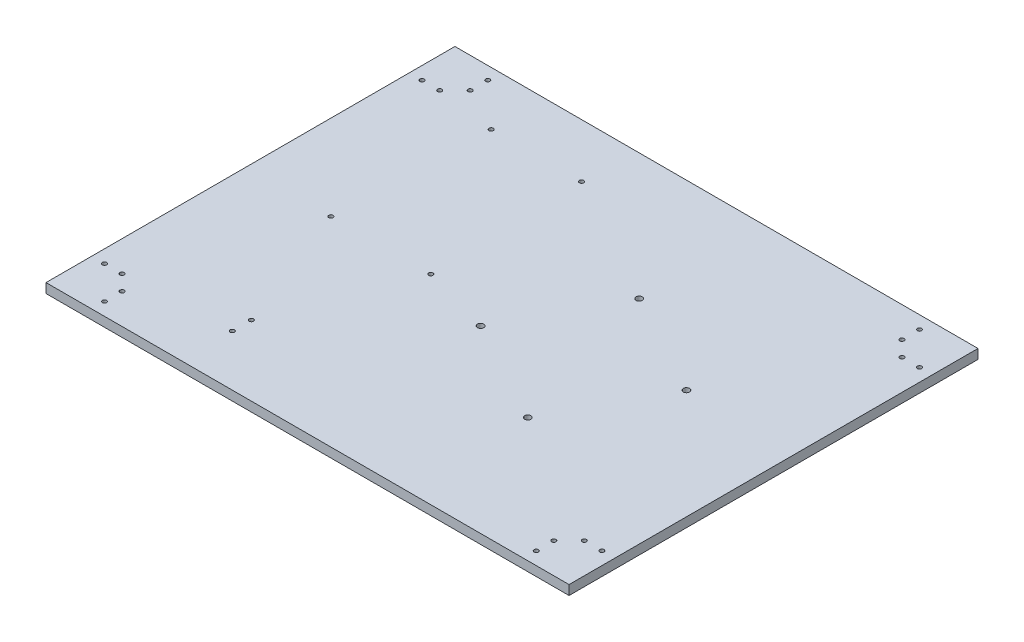
ISO-10303-21;
HEADER;
FILE_DESCRIPTION(('STEP AP214'),'2;1');
FILE_NAME('part.step','',(''),(''),'','','');
FILE_SCHEMA(('AUTOMOTIVE_DESIGN { 1 0 10303 214 1 1 1 1 }'));
ENDSEC;
DATA;
#1=APPLICATION_CONTEXT('core data for automotive mechanical design processes');
#2=APPLICATION_PROTOCOL_DEFINITION('international standard','automotive_design',2000,#1);
#3=PRODUCT_CONTEXT('',#1,'mechanical');
#4=PRODUCT('Part','Part','',(#3));
#5=PRODUCT_RELATED_PRODUCT_CATEGORY('part','',(#4));
#6=PRODUCT_DEFINITION_FORMATION('','',#4);
#7=PRODUCT_DEFINITION_CONTEXT('part definition',#1,'design');
#8=PRODUCT_DEFINITION('design','',#6,#7);
#9=PRODUCT_DEFINITION_SHAPE('','',#8);
#10=(LENGTH_UNIT() NAMED_UNIT(*) SI_UNIT(.MILLI.,.METRE.));
#11=(NAMED_UNIT(*) PLANE_ANGLE_UNIT() SI_UNIT($,.RADIAN.));
#12=(NAMED_UNIT(*) SI_UNIT($,.STERADIAN.) SOLID_ANGLE_UNIT());
#13=UNCERTAINTY_MEASURE_WITH_UNIT(LENGTH_MEASURE(1.E-05),#10,'distance_accuracy_value','');
#14=(GEOMETRIC_REPRESENTATION_CONTEXT(3) GLOBAL_UNCERTAINTY_ASSIGNED_CONTEXT((#13)) GLOBAL_UNIT_ASSIGNED_CONTEXT((#10,
#11,#12)) REPRESENTATION_CONTEXT('',''));
#15=CARTESIAN_POINT('',(0.,0.,0.));
#16=DIRECTION('',(0.,0.,1.));
#17=DIRECTION('',(1.,0.,0.));
#18=AXIS2_PLACEMENT_3D('',#15,#16,#17);
#19=CARTESIAN_POINT('',(-275.,10.,-215.));
#20=DIRECTION('',(1.,0.,0.));
#21=DIRECTION('',(0.,0.,-1.));
#22=AXIS2_PLACEMENT_3D('',#19,#20,#21);
#23=PLANE('',#22);
#24=DIRECTION('',(0.,0.,1.));
#25=VECTOR('',#24,1.);
#26=CARTESIAN_POINT('',(-275.,0.,-215.));
#27=LINE('',#26,#25);
#28=CARTESIAN_POINT('',(-275.,0.,-215.));
#29=VERTEX_POINT('',#28);
#30=CARTESIAN_POINT('',(-275.,0.,215.));
#31=VERTEX_POINT('',#30);
#32=EDGE_CURVE('E103',#29,#31,#27,.T.);
#33=ORIENTED_EDGE('',*,*,#32,.T.);
#34=DIRECTION('',(0.,-1.,0.));
#35=VECTOR('',#34,1.);
#36=CARTESIAN_POINT('',(-275.,10.,215.));
#37=LINE('',#36,#35);
#38=CARTESIAN_POINT('',(-275.,10.,215.));
#39=VERTEX_POINT('',#38);
#40=EDGE_CURVE('E11',#39,#31,#37,.T.);
#41=ORIENTED_EDGE('',*,*,#40,.F.);
#42=DIRECTION('',(0.,0.,1.));
#43=VECTOR('',#42,1.);
#44=CARTESIAN_POINT('',(-275.,10.,-215.));
#45=LINE('',#44,#43);
#46=CARTESIAN_POINT('',(-275.,10.,-215.));
#47=VERTEX_POINT('',#46);
#48=EDGE_CURVE('E90',#47,#39,#45,.T.);
#49=ORIENTED_EDGE('',*,*,#48,.F.);
#50=DIRECTION('',(0.,-1.,0.));
#51=VECTOR('',#50,1.);
#52=CARTESIAN_POINT('',(-275.,10.,-215.));
#53=LINE('',#52,#51);
#54=EDGE_CURVE('E99',#47,#29,#53,.T.);
#55=ORIENTED_EDGE('',*,*,#54,.T.);
#56=EDGE_LOOP('',(#33,#41,#49,#55));
#57=FACE_BOUND('',#56,.T.);
#58=ADVANCED_FACE('F37',(#57),#23,.F.);
#59=CARTESIAN_POINT('',(-275.,10.,215.));
#60=DIRECTION('',(0.,0.,-1.));
#61=DIRECTION('',(-1.,0.,0.));
#62=AXIS2_PLACEMENT_3D('',#59,#60,#61);
#63=PLANE('',#62);
#64=DIRECTION('',(1.,0.,0.));
#65=VECTOR('',#64,1.);
#66=CARTESIAN_POINT('',(-275.,0.,215.));
#67=LINE('',#66,#65);
#68=CARTESIAN_POINT('',(275.,0.,215.));
#69=VERTEX_POINT('',#68);
#70=EDGE_CURVE('E94',#31,#69,#67,.T.);
#71=ORIENTED_EDGE('',*,*,#70,.T.);
#72=DIRECTION('',(0.,-1.,0.));
#73=VECTOR('',#72,1.);
#74=CARTESIAN_POINT('',(275.,10.,215.));
#75=LINE('',#74,#73);
#76=CARTESIAN_POINT('',(275.,10.,215.));
#77=VERTEX_POINT('',#76);
#78=EDGE_CURVE('E46',#77,#69,#75,.T.);
#79=ORIENTED_EDGE('',*,*,#78,.F.);
#80=DIRECTION('',(1.,0.,0.));
#81=VECTOR('',#80,1.);
#82=CARTESIAN_POINT('',(-275.,10.,215.));
#83=LINE('',#82,#81);
#84=EDGE_CURVE('E85',#39,#77,#83,.T.);
#85=ORIENTED_EDGE('',*,*,#84,.F.);
#86=ORIENTED_EDGE('',*,*,#40,.T.);
#87=EDGE_LOOP('',(#71,#79,#85,#86));
#88=FACE_BOUND('',#87,.T.);
#89=ADVANCED_FACE('F93',(#88),#63,.F.);
#90=CARTESIAN_POINT('',(275.,10.,-215.));
#91=DIRECTION('',(-1.,0.,0.));
#92=DIRECTION('',(0.,0.,1.));
#93=AXIS2_PLACEMENT_3D('',#90,#91,#92);
#94=PLANE('',#93);
#95=DIRECTION('',(0.,0.,-1.));
#96=VECTOR('',#95,1.);
#97=CARTESIAN_POINT('',(275.,0.,-215.));
#98=LINE('',#97,#96);
#99=CARTESIAN_POINT('',(275.,0.,-215.));
#100=VERTEX_POINT('',#99);
#101=EDGE_CURVE('E72',#69,#100,#98,.T.);
#102=ORIENTED_EDGE('',*,*,#101,.T.);
#103=DIRECTION('',(0.,-1.,0.));
#104=VECTOR('',#103,1.);
#105=CARTESIAN_POINT('',(275.,10.,-215.));
#106=LINE('',#105,#104);
#107=CARTESIAN_POINT('',(275.,10.,-215.));
#108=VERTEX_POINT('',#107);
#109=EDGE_CURVE('E95',#108,#100,#106,.T.);
#110=ORIENTED_EDGE('',*,*,#109,.F.);
#111=DIRECTION('',(0.,0.,-1.));
#112=VECTOR('',#111,1.);
#113=CARTESIAN_POINT('',(275.,10.,-215.));
#114=LINE('',#113,#112);
#115=EDGE_CURVE('E88',#77,#108,#114,.T.);
#116=ORIENTED_EDGE('',*,*,#115,.F.);
#117=ORIENTED_EDGE('',*,*,#78,.T.);
#118=EDGE_LOOP('',(#102,#110,#116,#117));
#119=FACE_BOUND('',#118,.T.);
#120=ADVANCED_FACE('F97',(#119),#94,.F.);
#121=CARTESIAN_POINT('',(-275.,10.,-215.));
#122=DIRECTION('',(0.,0.,1.));
#123=DIRECTION('',(1.,0.,0.));
#124=AXIS2_PLACEMENT_3D('',#121,#122,#123);
#125=PLANE('',#124);
#126=DIRECTION('',(-1.,0.,0.));
#127=VECTOR('',#126,1.);
#128=CARTESIAN_POINT('',(-275.,0.,-215.));
#129=LINE('',#128,#127);
#130=EDGE_CURVE('E78',#100,#29,#129,.T.);
#131=ORIENTED_EDGE('',*,*,#130,.T.);
#132=ORIENTED_EDGE('',*,*,#54,.F.);
#133=DIRECTION('',(-1.,0.,0.));
#134=VECTOR('',#133,1.);
#135=CARTESIAN_POINT('',(-275.,10.,-215.));
#136=LINE('',#135,#134);
#137=EDGE_CURVE('E55',#108,#47,#136,.T.);
#138=ORIENTED_EDGE('',*,*,#137,.F.);
#139=ORIENTED_EDGE('',*,*,#109,.T.);
#140=EDGE_LOOP('',(#131,#132,#138,#139));
#141=FACE_BOUND('',#140,.T.);
#142=ADVANCED_FACE('F198',(#141),#125,.F.);
#143=CARTESIAN_POINT('',(0.,10.,0.));
#144=DIRECTION('',(0.,1.,0.));
#145=DIRECTION('',(0.,0.,1.));
#146=AXIS2_PLACEMENT_3D('',#143,#144,#145);
#147=PLANE('',#146);
#148=CARTESIAN_POINT('',(-185.379678999999,10.,4.99999999999939));
#149=DIRECTION('',(0.,1.,0.));
#150=DIRECTION('',(0.,0.,1.));
#151=AXIS2_PLACEMENT_3D('',#148,#149,#150);
#152=CIRCLE('',#151,2.25000000000001);
#153=CARTESIAN_POINT('',(-185.379678999999,10.,7.2499999999994));
#154=VERTEX_POINT('',#153);
#155=EDGE_CURVE('E671',#154,#154,#152,.T.);
#156=ORIENTED_EDGE('',*,*,#155,.F.);
#157=EDGE_LOOP('',(#156));
#158=FACE_BOUND('',#157,.T.);
#159=CARTESIAN_POINT('',(-80.3796789999997,10.,4.99999999999939));
#160=DIRECTION('',(0.,1.,0.));
#161=DIRECTION('',(0.,0.,1.));
#162=AXIS2_PLACEMENT_3D('',#159,#160,#161);
#163=CIRCLE('',#162,2.25);
#164=CARTESIAN_POINT('',(-80.3796789999997,10.,7.24999999999939));
#165=VERTEX_POINT('',#164);
#166=EDGE_CURVE('E677',#165,#165,#163,.T.);
#167=ORIENTED_EDGE('',*,*,#166,.F.);
#168=EDGE_LOOP('',(#167));
#169=FACE_BOUND('',#168,.T.);
#170=CARTESIAN_POINT('',(-85.3796789999992,10.,-158.500000000001));
#171=DIRECTION('',(0.,1.,0.));
#172=DIRECTION('',(0.,0.,1.));
#173=AXIS2_PLACEMENT_3D('',#170,#171,#172);
#174=CIRCLE('',#173,2.25);
#175=CARTESIAN_POINT('',(-85.3796789999992,10.,-156.250000000001));
#176=VERTEX_POINT('',#175);
#177=EDGE_CURVE('E666',#176,#176,#174,.T.);
#178=ORIENTED_EDGE('',*,*,#177,.F.);
#179=EDGE_LOOP('',(#178));
#180=FACE_BOUND('',#179,.T.);
#181=CARTESIAN_POINT('',(-180.379678999999,10.,-158.500000000001));
#182=DIRECTION('',(0.,1.,0.));
#183=DIRECTION('',(0.,0.,1.));
#184=AXIS2_PLACEMENT_3D('',#181,#182,#183);
#185=CIRCLE('',#184,2.25000000000001);
#186=CARTESIAN_POINT('',(-180.379678999999,10.,-156.250000000001));
#187=VERTEX_POINT('',#186);
#188=EDGE_CURVE('E663',#187,#187,#185,.T.);
#189=ORIENTED_EDGE('',*,*,#188,.F.);
#190=EDGE_LOOP('',(#189));
#191=FACE_BOUND('',#190,.T.);
#192=CARTESIAN_POINT('',(-132.921607377058,10.,161.135242980903));
#193=DIRECTION('',(0.,-1.,0.));
#194=DIRECTION('',(0.,0.,-1.));
#195=AXIS2_PLACEMENT_3D('',#192,#193,#194);
#196=CIRCLE('',#195,2.25000000000001);
#197=CARTESIAN_POINT('',(-132.921607377058,10.,158.885242980903));
#198=VERTEX_POINT('',#197);
#199=EDGE_CURVE('E630',#198,#198,#196,.T.);
#200=ORIENTED_EDGE('',*,*,#199,.T.);
#201=EDGE_LOOP('',(#200));
#202=FACE_BOUND('',#201,.T.);
#203=CARTESIAN_POINT('',(-132.921607377058,10.,141.135242980903));
#204=DIRECTION('',(0.,-1.,0.));
#205=DIRECTION('',(0.,0.,-1.));
#206=AXIS2_PLACEMENT_3D('',#203,#204,#205);
#207=CIRCLE('',#206,2.25000000000001);
#208=CARTESIAN_POINT('',(-132.921607377058,10.,138.885242980903));
#209=VERTEX_POINT('',#208);
#210=EDGE_CURVE('E651',#209,#209,#207,.T.);
#211=ORIENTED_EDGE('',*,*,#210,.T.);
#212=EDGE_LOOP('',(#211));
#213=FACE_BOUND('',#212,.T.);
#214=CARTESIAN_POINT('',(101.151165147925,10.,84.5267423870598));
#215=DIRECTION('',(0.,1.,0.));
#216=DIRECTION('',(0.,0.,1.));
#217=AXIS2_PLACEMENT_3D('',#214,#215,#216);
#218=CIRCLE('',#217,3.29999999999999);
#219=CARTESIAN_POINT('',(101.151165147925,10.,87.8267423870598));
#220=VERTEX_POINT('',#219);
#221=EDGE_CURVE('E645',#220,#220,#218,.T.);
#222=ORIENTED_EDGE('',*,*,#221,.F.);
#223=EDGE_LOOP('',(#222));
#224=FACE_BOUND('',#223,.T.);
#225=CARTESIAN_POINT('',(51.5287108520749,10.,-82.2473923870599));
#226=DIRECTION('',(0.,1.,0.));
#227=DIRECTION('',(0.,0.,1.));
#228=AXIS2_PLACEMENT_3D('',#225,#226,#227);
#229=CIRCLE('',#228,3.3);
#230=CARTESIAN_POINT('',(51.5287108520749,10.,-78.9473923870599));
#231=VERTEX_POINT('',#230);
#232=EDGE_CURVE('E642',#231,#231,#229,.T.);
#233=ORIENTED_EDGE('',*,*,#232,.F.);
#234=EDGE_LOOP('',(#233));
#235=FACE_BOUND('',#234,.T.);
#236=CARTESIAN_POINT('',(159.72700538706,10.,-23.6715521479252));
#237=DIRECTION('',(0.,1.,0.));
#238=DIRECTION('',(0.,0.,1.));
#239=AXIS2_PLACEMENT_3D('',#236,#237,#238);
#240=CIRCLE('',#239,3.3);
#241=CARTESIAN_POINT('',(159.72700538706,10.,-20.3715521479252));
#242=VERTEX_POINT('',#241);
#243=EDGE_CURVE('E636',#242,#242,#240,.T.);
#244=ORIENTED_EDGE('',*,*,#243,.F.);
#245=EDGE_LOOP('',(#244));
#246=FACE_BOUND('',#245,.T.);
#247=CARTESIAN_POINT('',(-7.04712938705974,10.,25.9509021479251));
#248=DIRECTION('',(0.,1.,0.));
#249=DIRECTION('',(0.,0.,1.));
#250=AXIS2_PLACEMENT_3D('',#247,#248,#249);
#251=CIRCLE('',#250,3.30000000000001);
#252=CARTESIAN_POINT('',(-7.04712938705974,10.,29.2509021479252));
#253=VERTEX_POINT('',#252);
#254=EDGE_CURVE('E629',#253,#253,#251,.T.);
#255=ORIENTED_EDGE('',*,*,#254,.F.);
#256=EDGE_LOOP('',(#255));
#257=FACE_BOUND('',#256,.T.);
#258=CARTESIAN_POINT('',(261.5,10.,167.));
#259=DIRECTION('',(0.,1.,0.));
#260=DIRECTION('',(0.,0.,1.));
#261=AXIS2_PLACEMENT_3D('',#258,#259,#260);
#262=CIRCLE('',#261,2.24999999999996);
#263=CARTESIAN_POINT('',(261.5,10.,169.25));
#264=VERTEX_POINT('',#263);
#265=EDGE_CURVE('E551',#264,#264,#262,.T.);
#266=ORIENTED_EDGE('',*,*,#265,.F.);
#267=EDGE_LOOP('',(#266));
#268=FACE_BOUND('',#267,.T.);
#269=CARTESIAN_POINT('',(261.5,10.,-167.));
#270=DIRECTION('',(0.,1.,0.));
#271=DIRECTION('',(0.,0.,1.));
#272=AXIS2_PLACEMENT_3D('',#269,#270,#271);
#273=CIRCLE('',#272,2.24999999999996);
#274=CARTESIAN_POINT('',(261.5,10.,-164.75));
#275=VERTEX_POINT('',#274);
#276=EDGE_CURVE('E554',#275,#275,#273,.T.);
#277=ORIENTED_EDGE('',*,*,#276,.F.);
#278=EDGE_LOOP('',(#277));
#279=FACE_BOUND('',#278,.T.);
#280=CARTESIAN_POINT('',(243.,10.,-167.));
#281=DIRECTION('',(0.,1.,0.));
#282=DIRECTION('',(0.,0.,1.));
#283=AXIS2_PLACEMENT_3D('',#280,#281,#282);
#284=CIRCLE('',#283,2.25000000000001);
#285=CARTESIAN_POINT('',(243.,10.,-164.75));
#286=VERTEX_POINT('',#285);
#287=EDGE_CURVE('E573',#286,#286,#284,.T.);
#288=ORIENTED_EDGE('',*,*,#287,.F.);
#289=EDGE_LOOP('',(#288));
#290=FACE_BOUND('',#289,.T.);
#291=CARTESIAN_POINT('',(227.,10.,-183.));
#292=DIRECTION('',(0.,1.,0.));
#293=DIRECTION('',(0.,0.,1.));
#294=AXIS2_PLACEMENT_3D('',#291,#292,#293);
#295=CIRCLE('',#294,2.25000000000001);
#296=CARTESIAN_POINT('',(227.,10.,-180.75));
#297=VERTEX_POINT('',#296);
#298=EDGE_CURVE('E569',#297,#297,#295,.T.);
#299=ORIENTED_EDGE('',*,*,#298,.F.);
#300=EDGE_LOOP('',(#299));
#301=FACE_BOUND('',#300,.T.);
#302=CARTESIAN_POINT('',(-227.,10.,-183.));
#303=DIRECTION('',(0.,1.,0.));
#304=DIRECTION('',(0.,0.,1.));
#305=AXIS2_PLACEMENT_3D('',#302,#303,#304);
#306=CIRCLE('',#305,2.25000000000001);
#307=CARTESIAN_POINT('',(-227.,10.,-180.75));
#308=VERTEX_POINT('',#307);
#309=EDGE_CURVE('E584',#308,#308,#306,.T.);
#310=ORIENTED_EDGE('',*,*,#309,.F.);
#311=EDGE_LOOP('',(#310));
#312=FACE_BOUND('',#311,.T.);
#313=CARTESIAN_POINT('',(-243.,10.,-167.));
#314=DIRECTION('',(0.,1.,0.));
#315=DIRECTION('',(0.,0.,1.));
#316=AXIS2_PLACEMENT_3D('',#313,#314,#315);
#317=CIRCLE('',#316,2.25000000000001);
#318=CARTESIAN_POINT('',(-243.,10.,-164.75));
#319=VERTEX_POINT('',#318);
#320=EDGE_CURVE('E581',#319,#319,#317,.T.);
#321=ORIENTED_EDGE('',*,*,#320,.F.);
#322=EDGE_LOOP('',(#321));
#323=FACE_BOUND('',#322,.T.);
#324=CARTESIAN_POINT('',(-261.5,10.,-167.));
#325=DIRECTION('',(0.,1.,0.));
#326=DIRECTION('',(0.,0.,1.));
#327=AXIS2_PLACEMENT_3D('',#324,#325,#326);
#328=CIRCLE('',#327,2.24999999999996);
#329=CARTESIAN_POINT('',(-261.5,10.,-164.75));
#330=VERTEX_POINT('',#329);
#331=EDGE_CURVE('E578',#330,#330,#328,.T.);
#332=ORIENTED_EDGE('',*,*,#331,.F.);
#333=EDGE_LOOP('',(#332));
#334=FACE_BOUND('',#333,.T.);
#335=CARTESIAN_POINT('',(227.,10.,-201.5));
#336=DIRECTION('',(0.,1.,0.));
#337=DIRECTION('',(0.,0.,1.));
#338=AXIS2_PLACEMENT_3D('',#335,#336,#337);
#339=CIRCLE('',#338,2.25000000000001);
#340=CARTESIAN_POINT('',(227.,10.,-199.25));
#341=VERTEX_POINT('',#340);
#342=EDGE_CURVE('E572',#341,#341,#339,.T.);
#343=ORIENTED_EDGE('',*,*,#342,.F.);
#344=EDGE_LOOP('',(#343));
#345=FACE_BOUND('',#344,.T.);
#346=CARTESIAN_POINT('',(-261.5,10.,167.));
#347=DIRECTION('',(0.,1.,0.));
#348=DIRECTION('',(0.,0.,1.));
#349=AXIS2_PLACEMENT_3D('',#346,#347,#348);
#350=CIRCLE('',#349,2.24999999999996);
#351=CARTESIAN_POINT('',(-261.5,10.,169.25));
#352=VERTEX_POINT('',#351);
#353=EDGE_CURVE('E560',#352,#352,#350,.T.);
#354=ORIENTED_EDGE('',*,*,#353,.F.);
#355=EDGE_LOOP('',(#354));
#356=FACE_BOUND('',#355,.T.);
#357=CARTESIAN_POINT('',(-243.,10.,167.));
#358=DIRECTION('',(0.,1.,0.));
#359=DIRECTION('',(0.,0.,1.));
#360=AXIS2_PLACEMENT_3D('',#357,#358,#359);
#361=CIRCLE('',#360,2.25000000000001);
#362=CARTESIAN_POINT('',(-243.,10.,169.25));
#363=VERTEX_POINT('',#362);
#364=EDGE_CURVE('E606',#363,#363,#361,.T.);
#365=ORIENTED_EDGE('',*,*,#364,.F.);
#366=EDGE_LOOP('',(#365));
#367=FACE_BOUND('',#366,.T.);
#368=CARTESIAN_POINT('',(-227.,10.,183.));
#369=DIRECTION('',(0.,1.,0.));
#370=DIRECTION('',(0.,0.,1.));
#371=AXIS2_PLACEMENT_3D('',#368,#369,#370);
#372=CIRCLE('',#371,2.25000000000001);
#373=CARTESIAN_POINT('',(-227.,10.,185.25));
#374=VERTEX_POINT('',#373);
#375=EDGE_CURVE('E568',#374,#374,#372,.T.);
#376=ORIENTED_EDGE('',*,*,#375,.F.);
#377=EDGE_LOOP('',(#376));
#378=FACE_BOUND('',#377,.T.);
#379=CARTESIAN_POINT('',(-227.,10.,201.5));
#380=DIRECTION('',(0.,1.,0.));
#381=DIRECTION('',(0.,0.,1.));
#382=AXIS2_PLACEMENT_3D('',#379,#380,#381);
#383=CIRCLE('',#382,2.25000000000001);
#384=CARTESIAN_POINT('',(-227.,10.,203.75));
#385=VERTEX_POINT('',#384);
#386=EDGE_CURVE('E565',#385,#385,#383,.T.);
#387=ORIENTED_EDGE('',*,*,#386,.F.);
#388=EDGE_LOOP('',(#387));
#389=FACE_BOUND('',#388,.T.);
#390=CARTESIAN_POINT('',(227.,10.,201.5));
#391=DIRECTION('',(0.,1.,0.));
#392=DIRECTION('',(0.,0.,1.));
#393=AXIS2_PLACEMENT_3D('',#390,#391,#392);
#394=CIRCLE('',#393,2.25000000000001);
#395=CARTESIAN_POINT('',(227.,10.,203.75));
#396=VERTEX_POINT('',#395);
#397=EDGE_CURVE('E557',#396,#396,#394,.T.);
#398=ORIENTED_EDGE('',*,*,#397,.F.);
#399=EDGE_LOOP('',(#398));
#400=FACE_BOUND('',#399,.T.);
#401=CARTESIAN_POINT('',(227.,10.,183.));
#402=DIRECTION('',(0.,1.,0.));
#403=DIRECTION('',(0.,0.,1.));
#404=AXIS2_PLACEMENT_3D('',#401,#402,#403);
#405=CIRCLE('',#404,2.25000000000001);
#406=CARTESIAN_POINT('',(227.,10.,185.25));
#407=VERTEX_POINT('',#406);
#408=EDGE_CURVE('E552',#407,#407,#405,.T.);
#409=ORIENTED_EDGE('',*,*,#408,.F.);
#410=EDGE_LOOP('',(#409));
#411=FACE_BOUND('',#410,.T.);
#412=CARTESIAN_POINT('',(243.,10.,167.));
#413=DIRECTION('',(0.,1.,0.));
#414=DIRECTION('',(0.,0.,1.));
#415=AXIS2_PLACEMENT_3D('',#412,#413,#414);
#416=CIRCLE('',#415,2.25000000000001);
#417=CARTESIAN_POINT('',(243.,10.,169.25));
#418=VERTEX_POINT('',#417);
#419=EDGE_CURVE('E544',#418,#418,#416,.T.);
#420=ORIENTED_EDGE('',*,*,#419,.F.);
#421=EDGE_LOOP('',(#420));
#422=FACE_BOUND('',#421,.T.);
#423=CARTESIAN_POINT('',(-227.,10.,-201.5));
#424=DIRECTION('',(0.,1.,0.));
#425=DIRECTION('',(0.,0.,1.));
#426=AXIS2_PLACEMENT_3D('',#423,#424,#425);
#427=CIRCLE('',#426,2.25000000000001);
#428=CARTESIAN_POINT('',(-227.,10.,-199.25));
#429=VERTEX_POINT('',#428);
#430=EDGE_CURVE('E115',#429,#429,#427,.T.);
#431=ORIENTED_EDGE('',*,*,#430,.F.);
#432=EDGE_LOOP('',(#431));
#433=FACE_BOUND('',#432,.T.);
#434=ORIENTED_EDGE('',*,*,#48,.T.);
#435=ORIENTED_EDGE('',*,*,#84,.T.);
#436=ORIENTED_EDGE('',*,*,#115,.T.);
#437=ORIENTED_EDGE('',*,*,#137,.T.);
#438=EDGE_LOOP('',(#434,#435,#436,#437));
#439=FACE_BOUND('',#438,.T.);
#440=ADVANCED_FACE('F86',(#158,#169,#180,#191,#202,#213,#224,#235,#246,#257,#268,#279,#290,#301,
#312,#323,#334,#345,#356,#367,#378,#389,#400,#411,#422,#433,#439),#147,.T.);
#441=CARTESIAN_POINT('',(0.,0.,0.));
#442=DIRECTION('',(0.,1.,0.));
#443=DIRECTION('',(0.,0.,1.));
#444=AXIS2_PLACEMENT_3D('',#441,#442,#443);
#445=PLANE('',#444);
#446=CARTESIAN_POINT('',(-185.379678999999,0.,4.99999999999939));
#447=DIRECTION('',(0.,1.,0.));
#448=DIRECTION('',(0.,0.,1.));
#449=AXIS2_PLACEMENT_3D('',#446,#447,#448);
#450=CIRCLE('',#449,2.25000000000001);
#451=CARTESIAN_POINT('',(-185.379678999999,0.,7.2499999999994));
#452=VERTEX_POINT('',#451);
#453=EDGE_CURVE('E669',#452,#452,#450,.T.);
#454=ORIENTED_EDGE('',*,*,#453,.T.);
#455=EDGE_LOOP('',(#454));
#456=FACE_BOUND('',#455,.T.);
#457=CARTESIAN_POINT('',(-80.3796789999997,0.,4.99999999999939));
#458=DIRECTION('',(0.,1.,0.));
#459=DIRECTION('',(0.,0.,1.));
#460=AXIS2_PLACEMENT_3D('',#457,#458,#459);
#461=CIRCLE('',#460,2.25);
#462=CARTESIAN_POINT('',(-80.3796789999997,0.,7.24999999999939));
#463=VERTEX_POINT('',#462);
#464=EDGE_CURVE('E674',#463,#463,#461,.T.);
#465=ORIENTED_EDGE('',*,*,#464,.T.);
#466=EDGE_LOOP('',(#465));
#467=FACE_BOUND('',#466,.T.);
#468=CARTESIAN_POINT('',(-85.3796789999992,0.,-158.500000000001));
#469=DIRECTION('',(0.,1.,0.));
#470=DIRECTION('',(0.,0.,1.));
#471=AXIS2_PLACEMENT_3D('',#468,#469,#470);
#472=CIRCLE('',#471,2.25);
#473=CARTESIAN_POINT('',(-85.3796789999992,0.,-156.250000000001));
#474=VERTEX_POINT('',#473);
#475=EDGE_CURVE('E680',#474,#474,#472,.T.);
#476=ORIENTED_EDGE('',*,*,#475,.T.);
#477=EDGE_LOOP('',(#476));
#478=FACE_BOUND('',#477,.T.);
#479=CARTESIAN_POINT('',(-180.379678999999,0.,-158.500000000001));
#480=DIRECTION('',(0.,1.,0.));
#481=DIRECTION('',(0.,0.,1.));
#482=AXIS2_PLACEMENT_3D('',#479,#480,#481);
#483=CIRCLE('',#482,2.25000000000001);
#484=CARTESIAN_POINT('',(-180.379678999999,0.,-156.250000000001));
#485=VERTEX_POINT('',#484);
#486=EDGE_CURVE('E655',#485,#485,#483,.T.);
#487=ORIENTED_EDGE('',*,*,#486,.T.);
#488=EDGE_LOOP('',(#487));
#489=FACE_BOUND('',#488,.T.);
#490=CARTESIAN_POINT('',(-132.921607377058,0.,161.135242980903));
#491=DIRECTION('',(0.,-1.,0.));
#492=DIRECTION('',(0.,0.,-1.));
#493=AXIS2_PLACEMENT_3D('',#490,#491,#492);
#494=CIRCLE('',#493,2.25000000000001);
#495=CARTESIAN_POINT('',(-132.921607377058,0.,158.885242980903));
#496=VERTEX_POINT('',#495);
#497=EDGE_CURVE('E658',#496,#496,#494,.T.);
#498=ORIENTED_EDGE('',*,*,#497,.F.);
#499=EDGE_LOOP('',(#498));
#500=FACE_BOUND('',#499,.T.);
#501=CARTESIAN_POINT('',(-132.921607377058,0.,141.135242980903));
#502=DIRECTION('',(0.,-1.,0.));
#503=DIRECTION('',(0.,0.,-1.));
#504=AXIS2_PLACEMENT_3D('',#501,#502,#503);
#505=CIRCLE('',#504,2.25000000000001);
#506=CARTESIAN_POINT('',(-132.921607377058,0.,138.885242980903));
#507=VERTEX_POINT('',#506);
#508=EDGE_CURVE('E654',#507,#507,#505,.T.);
#509=ORIENTED_EDGE('',*,*,#508,.F.);
#510=EDGE_LOOP('',(#509));
#511=FACE_BOUND('',#510,.T.);
#512=CARTESIAN_POINT('',(101.151165147925,0.,84.5267423870598));
#513=DIRECTION('',(0.,1.,0.));
#514=DIRECTION('',(0.,0.,1.));
#515=AXIS2_PLACEMENT_3D('',#512,#513,#514);
#516=CIRCLE('',#515,3.29999999999999);
#517=CARTESIAN_POINT('',(101.151165147925,0.,87.8267423870598));
#518=VERTEX_POINT('',#517);
#519=EDGE_CURVE('E648',#518,#518,#516,.T.);
#520=ORIENTED_EDGE('',*,*,#519,.T.);
#521=EDGE_LOOP('',(#520));
#522=FACE_BOUND('',#521,.T.);
#523=CARTESIAN_POINT('',(51.5287108520749,0.,-82.2473923870599));
#524=DIRECTION('',(0.,1.,0.));
#525=DIRECTION('',(0.,0.,1.));
#526=AXIS2_PLACEMENT_3D('',#523,#524,#525);
#527=CIRCLE('',#526,3.3);
#528=CARTESIAN_POINT('',(51.5287108520749,0.,-78.9473923870599));
#529=VERTEX_POINT('',#528);
#530=EDGE_CURVE('E639',#529,#529,#527,.T.);
#531=ORIENTED_EDGE('',*,*,#530,.T.);
#532=EDGE_LOOP('',(#531));
#533=FACE_BOUND('',#532,.T.);
#534=CARTESIAN_POINT('',(159.72700538706,0.,-23.6715521479252));
#535=DIRECTION('',(0.,1.,0.));
#536=DIRECTION('',(0.,0.,1.));
#537=AXIS2_PLACEMENT_3D('',#534,#535,#536);
#538=CIRCLE('',#537,3.3);
#539=CARTESIAN_POINT('',(159.72700538706,0.,-20.3715521479252));
#540=VERTEX_POINT('',#539);
#541=EDGE_CURVE('E633',#540,#540,#538,.T.);
#542=ORIENTED_EDGE('',*,*,#541,.T.);
#543=EDGE_LOOP('',(#542));
#544=FACE_BOUND('',#543,.T.);
#545=CARTESIAN_POINT('',(-7.04712938705974,0.,25.9509021479251));
#546=DIRECTION('',(0.,1.,0.));
#547=DIRECTION('',(0.,0.,1.));
#548=AXIS2_PLACEMENT_3D('',#545,#546,#547);
#549=CIRCLE('',#548,3.30000000000001);
#550=CARTESIAN_POINT('',(-7.04712938705974,0.,29.2509021479252));
#551=VERTEX_POINT('',#550);
#552=EDGE_CURVE('E626',#551,#551,#549,.T.);
#553=ORIENTED_EDGE('',*,*,#552,.T.);
#554=EDGE_LOOP('',(#553));
#555=FACE_BOUND('',#554,.T.);
#556=CARTESIAN_POINT('',(261.5,0.,167.));
#557=DIRECTION('',(0.,1.,0.));
#558=DIRECTION('',(0.,0.,1.));
#559=AXIS2_PLACEMENT_3D('',#556,#557,#558);
#560=CIRCLE('',#559,2.24999999999996);
#561=CARTESIAN_POINT('',(261.5,0.,169.25));
#562=VERTEX_POINT('',#561);
#563=EDGE_CURVE('E40',#562,#562,#560,.T.);
#564=ORIENTED_EDGE('',*,*,#563,.T.);
#565=EDGE_LOOP('',(#564));
#566=FACE_BOUND('',#565,.T.);
#567=CARTESIAN_POINT('',(261.5,0.,-167.));
#568=DIRECTION('',(0.,1.,0.));
#569=DIRECTION('',(0.,0.,1.));
#570=AXIS2_PLACEMENT_3D('',#567,#568,#569);
#571=CIRCLE('',#570,2.24999999999996);
#572=CARTESIAN_POINT('',(261.5,0.,-164.75));
#573=VERTEX_POINT('',#572);
#574=EDGE_CURVE('E153',#573,#573,#571,.T.);
#575=ORIENTED_EDGE('',*,*,#574,.T.);
#576=EDGE_LOOP('',(#575));
#577=FACE_BOUND('',#576,.T.);
#578=CARTESIAN_POINT('',(243.,0.,-167.));
#579=DIRECTION('',(0.,1.,0.));
#580=DIRECTION('',(0.,0.,1.));
#581=AXIS2_PLACEMENT_3D('',#578,#579,#580);
#582=CIRCLE('',#581,2.25000000000001);
#583=CARTESIAN_POINT('',(243.,0.,-164.75));
#584=VERTEX_POINT('',#583);
#585=EDGE_CURVE('E151',#584,#584,#582,.T.);
#586=ORIENTED_EDGE('',*,*,#585,.T.);
#587=EDGE_LOOP('',(#586));
#588=FACE_BOUND('',#587,.T.);
#589=CARTESIAN_POINT('',(227.,0.,-183.));
#590=DIRECTION('',(0.,1.,0.));
#591=DIRECTION('',(0.,0.,1.));
#592=AXIS2_PLACEMENT_3D('',#589,#590,#591);
#593=CIRCLE('',#592,2.25000000000001);
#594=CARTESIAN_POINT('',(227.,0.,-180.75));
#595=VERTEX_POINT('',#594);
#596=EDGE_CURVE('E148',#595,#595,#593,.T.);
#597=ORIENTED_EDGE('',*,*,#596,.T.);
#598=EDGE_LOOP('',(#597));
#599=FACE_BOUND('',#598,.T.);
#600=CARTESIAN_POINT('',(-227.,0.,-183.));
#601=DIRECTION('',(0.,1.,0.));
#602=DIRECTION('',(0.,0.,1.));
#603=AXIS2_PLACEMENT_3D('',#600,#601,#602);
#604=CIRCLE('',#603,2.25000000000001);
#605=CARTESIAN_POINT('',(-227.,0.,-180.75));
#606=VERTEX_POINT('',#605);
#607=EDGE_CURVE('E145',#606,#606,#604,.T.);
#608=ORIENTED_EDGE('',*,*,#607,.T.);
#609=EDGE_LOOP('',(#608));
#610=FACE_BOUND('',#609,.T.);
#611=CARTESIAN_POINT('',(-243.,0.,-167.));
#612=DIRECTION('',(0.,1.,0.));
#613=DIRECTION('',(0.,0.,1.));
#614=AXIS2_PLACEMENT_3D('',#611,#612,#613);
#615=CIRCLE('',#614,2.25000000000001);
#616=CARTESIAN_POINT('',(-243.,0.,-164.75));
#617=VERTEX_POINT('',#616);
#618=EDGE_CURVE('E142',#617,#617,#615,.T.);
#619=ORIENTED_EDGE('',*,*,#618,.T.);
#620=EDGE_LOOP('',(#619));
#621=FACE_BOUND('',#620,.T.);
#622=CARTESIAN_POINT('',(-261.5,0.,-167.));
#623=DIRECTION('',(0.,1.,0.));
#624=DIRECTION('',(0.,0.,1.));
#625=AXIS2_PLACEMENT_3D('',#622,#623,#624);
#626=CIRCLE('',#625,2.24999999999996);
#627=CARTESIAN_POINT('',(-261.5,0.,-164.75));
#628=VERTEX_POINT('',#627);
#629=EDGE_CURVE('E139',#628,#628,#626,.T.);
#630=ORIENTED_EDGE('',*,*,#629,.T.);
#631=EDGE_LOOP('',(#630));
#632=FACE_BOUND('',#631,.T.);
#633=CARTESIAN_POINT('',(227.,0.,-201.5));
#634=DIRECTION('',(0.,1.,0.));
#635=DIRECTION('',(0.,0.,1.));
#636=AXIS2_PLACEMENT_3D('',#633,#634,#635);
#637=CIRCLE('',#636,2.25000000000001);
#638=CARTESIAN_POINT('',(227.,0.,-199.25));
#639=VERTEX_POINT('',#638);
#640=EDGE_CURVE('E136',#639,#639,#637,.T.);
#641=ORIENTED_EDGE('',*,*,#640,.T.);
#642=EDGE_LOOP('',(#641));
#643=FACE_BOUND('',#642,.T.);
#644=CARTESIAN_POINT('',(-261.5,0.,167.));
#645=DIRECTION('',(0.,1.,0.));
#646=DIRECTION('',(0.,0.,1.));
#647=AXIS2_PLACEMENT_3D('',#644,#645,#646);
#648=CIRCLE('',#647,2.24999999999996);
#649=CARTESIAN_POINT('',(-261.5,0.,169.25));
#650=VERTEX_POINT('',#649);
#651=EDGE_CURVE('E133',#650,#650,#648,.T.);
#652=ORIENTED_EDGE('',*,*,#651,.T.);
#653=EDGE_LOOP('',(#652));
#654=FACE_BOUND('',#653,.T.);
#655=CARTESIAN_POINT('',(-243.,0.,167.));
#656=DIRECTION('',(0.,1.,0.));
#657=DIRECTION('',(0.,0.,1.));
#658=AXIS2_PLACEMENT_3D('',#655,#656,#657);
#659=CIRCLE('',#658,2.25000000000001);
#660=CARTESIAN_POINT('',(-243.,0.,169.25));
#661=VERTEX_POINT('',#660);
#662=EDGE_CURVE('E130',#661,#661,#659,.T.);
#663=ORIENTED_EDGE('',*,*,#662,.T.);
#664=EDGE_LOOP('',(#663));
#665=FACE_BOUND('',#664,.T.);
#666=CARTESIAN_POINT('',(-227.,0.,183.));
#667=DIRECTION('',(0.,1.,0.));
#668=DIRECTION('',(0.,0.,1.));
#669=AXIS2_PLACEMENT_3D('',#666,#667,#668);
#670=CIRCLE('',#669,2.25000000000001);
#671=CARTESIAN_POINT('',(-227.,0.,185.25));
#672=VERTEX_POINT('',#671);
#673=EDGE_CURVE('E127',#672,#672,#670,.T.);
#674=ORIENTED_EDGE('',*,*,#673,.T.);
#675=EDGE_LOOP('',(#674));
#676=FACE_BOUND('',#675,.T.);
#677=CARTESIAN_POINT('',(-227.,0.,201.5));
#678=DIRECTION('',(0.,1.,0.));
#679=DIRECTION('',(0.,0.,1.));
#680=AXIS2_PLACEMENT_3D('',#677,#678,#679);
#681=CIRCLE('',#680,2.25000000000001);
#682=CARTESIAN_POINT('',(-227.,0.,203.75));
#683=VERTEX_POINT('',#682);
#684=EDGE_CURVE('E124',#683,#683,#681,.T.);
#685=ORIENTED_EDGE('',*,*,#684,.T.);
#686=EDGE_LOOP('',(#685));
#687=FACE_BOUND('',#686,.T.);
#688=CARTESIAN_POINT('',(227.,0.,201.5));
#689=DIRECTION('',(0.,1.,0.));
#690=DIRECTION('',(0.,0.,1.));
#691=AXIS2_PLACEMENT_3D('',#688,#689,#690);
#692=CIRCLE('',#691,2.25000000000001);
#693=CARTESIAN_POINT('',(227.,0.,203.75));
#694=VERTEX_POINT('',#693);
#695=EDGE_CURVE('E121',#694,#694,#692,.T.);
#696=ORIENTED_EDGE('',*,*,#695,.T.);
#697=EDGE_LOOP('',(#696));
#698=FACE_BOUND('',#697,.T.);
#699=CARTESIAN_POINT('',(227.,0.,183.));
#700=DIRECTION('',(0.,1.,0.));
#701=DIRECTION('',(0.,0.,1.));
#702=AXIS2_PLACEMENT_3D('',#699,#700,#701);
#703=CIRCLE('',#702,2.25000000000001);
#704=CARTESIAN_POINT('',(227.,0.,185.25));
#705=VERTEX_POINT('',#704);
#706=EDGE_CURVE('E118',#705,#705,#703,.T.);
#707=ORIENTED_EDGE('',*,*,#706,.T.);
#708=EDGE_LOOP('',(#707));
#709=FACE_BOUND('',#708,.T.);
#710=CARTESIAN_POINT('',(243.,0.,167.));
#711=DIRECTION('',(0.,1.,0.));
#712=DIRECTION('',(0.,0.,1.));
#713=AXIS2_PLACEMENT_3D('',#710,#711,#712);
#714=CIRCLE('',#713,2.25000000000001);
#715=CARTESIAN_POINT('',(243.,0.,169.25));
#716=VERTEX_POINT('',#715);
#717=EDGE_CURVE('E114',#716,#716,#714,.T.);
#718=ORIENTED_EDGE('',*,*,#717,.T.);
#719=EDGE_LOOP('',(#718));
#720=FACE_BOUND('',#719,.T.);
#721=CARTESIAN_POINT('',(-227.,0.,-201.5));
#722=DIRECTION('',(0.,1.,0.));
#723=DIRECTION('',(0.,0.,1.));
#724=AXIS2_PLACEMENT_3D('',#721,#722,#723);
#725=CIRCLE('',#724,2.25000000000001);
#726=CARTESIAN_POINT('',(-227.,0.,-199.25));
#727=VERTEX_POINT('',#726);
#728=EDGE_CURVE('E111',#727,#727,#725,.T.);
#729=ORIENTED_EDGE('',*,*,#728,.T.);
#730=EDGE_LOOP('',(#729));
#731=FACE_BOUND('',#730,.T.);
#732=ORIENTED_EDGE('',*,*,#32,.F.);
#733=ORIENTED_EDGE('',*,*,#130,.F.);
#734=ORIENTED_EDGE('',*,*,#101,.F.);
#735=ORIENTED_EDGE('',*,*,#70,.F.);
#736=EDGE_LOOP('',(#732,#733,#734,#735));
#737=FACE_BOUND('',#736,.T.);
#738=ADVANCED_FACE('F160',(#456,#467,#478,#489,#500,#511,#522,#533,#544,#555,#566,#577,#588,
#599,#610,#621,#632,#643,#654,#665,#676,#687,#698,#709,#720,#731,#737),#445,.F.);
#739=CARTESIAN_POINT('',(-227.,-10.,-201.5));
#740=DIRECTION('',(0.,1.,0.));
#741=DIRECTION('',(0.,0.,1.));
#742=AXIS2_PLACEMENT_3D('',#739,#740,#741);
#743=CYLINDRICAL_SURFACE('',#742,2.25000000000001);
#744=ORIENTED_EDGE('',*,*,#430,.T.);
#745=EDGE_LOOP('',(#744));
#746=FACE_BOUND('',#745,.T.);
#747=ORIENTED_EDGE('',*,*,#728,.F.);
#748=EDGE_LOOP('',(#747));
#749=FACE_BOUND('',#748,.T.);
#750=ADVANCED_FACE('F188',(#746,#749),#743,.F.);
#751=CARTESIAN_POINT('',(243.,-10.,167.));
#752=DIRECTION('',(0.,1.,0.));
#753=DIRECTION('',(0.,0.,1.));
#754=AXIS2_PLACEMENT_3D('',#751,#752,#753);
#755=CYLINDRICAL_SURFACE('',#754,2.25000000000001);
#756=ORIENTED_EDGE('',*,*,#419,.T.);
#757=EDGE_LOOP('',(#756));
#758=FACE_BOUND('',#757,.T.);
#759=ORIENTED_EDGE('',*,*,#717,.F.);
#760=EDGE_LOOP('',(#759));
#761=FACE_BOUND('',#760,.T.);
#762=ADVANCED_FACE('F195',(#758,#761),#755,.F.);
#763=CARTESIAN_POINT('',(227.,-10.,183.));
#764=DIRECTION('',(0.,1.,0.));
#765=DIRECTION('',(0.,0.,1.));
#766=AXIS2_PLACEMENT_3D('',#763,#764,#765);
#767=CYLINDRICAL_SURFACE('',#766,2.25000000000001);
#768=ORIENTED_EDGE('',*,*,#408,.T.);
#769=EDGE_LOOP('',(#768));
#770=FACE_BOUND('',#769,.T.);
#771=ORIENTED_EDGE('',*,*,#706,.F.);
#772=EDGE_LOOP('',(#771));
#773=FACE_BOUND('',#772,.T.);
#774=ADVANCED_FACE('F450',(#770,#773),#767,.F.);
#775=CARTESIAN_POINT('',(227.,-10.,201.5));
#776=DIRECTION('',(0.,1.,0.));
#777=DIRECTION('',(0.,0.,1.));
#778=AXIS2_PLACEMENT_3D('',#775,#776,#777);
#779=CYLINDRICAL_SURFACE('',#778,2.25000000000001);
#780=ORIENTED_EDGE('',*,*,#397,.T.);
#781=EDGE_LOOP('',(#780));
#782=FACE_BOUND('',#781,.T.);
#783=ORIENTED_EDGE('',*,*,#695,.F.);
#784=EDGE_LOOP('',(#783));
#785=FACE_BOUND('',#784,.T.);
#786=ADVANCED_FACE('F440',(#782,#785),#779,.F.);
#787=CARTESIAN_POINT('',(-227.,-10.,201.5));
#788=DIRECTION('',(0.,1.,0.));
#789=DIRECTION('',(0.,0.,1.));
#790=AXIS2_PLACEMENT_3D('',#787,#788,#789);
#791=CYLINDRICAL_SURFACE('',#790,2.25000000000001);
#792=ORIENTED_EDGE('',*,*,#386,.T.);
#793=EDGE_LOOP('',(#792));
#794=FACE_BOUND('',#793,.T.);
#795=ORIENTED_EDGE('',*,*,#684,.F.);
#796=EDGE_LOOP('',(#795));
#797=FACE_BOUND('',#796,.T.);
#798=ADVANCED_FACE('F430',(#794,#797),#791,.F.);
#799=CARTESIAN_POINT('',(-227.,-10.,183.));
#800=DIRECTION('',(0.,1.,0.));
#801=DIRECTION('',(0.,0.,1.));
#802=AXIS2_PLACEMENT_3D('',#799,#800,#801);
#803=CYLINDRICAL_SURFACE('',#802,2.25000000000001);
#804=ORIENTED_EDGE('',*,*,#375,.T.);
#805=EDGE_LOOP('',(#804));
#806=FACE_BOUND('',#805,.T.);
#807=ORIENTED_EDGE('',*,*,#673,.F.);
#808=EDGE_LOOP('',(#807));
#809=FACE_BOUND('',#808,.T.);
#810=ADVANCED_FACE('F420',(#806,#809),#803,.F.);
#811=CARTESIAN_POINT('',(-243.,-10.,167.));
#812=DIRECTION('',(0.,1.,0.));
#813=DIRECTION('',(0.,0.,1.));
#814=AXIS2_PLACEMENT_3D('',#811,#812,#813);
#815=CYLINDRICAL_SURFACE('',#814,2.25000000000001);
#816=ORIENTED_EDGE('',*,*,#364,.T.);
#817=EDGE_LOOP('',(#816));
#818=FACE_BOUND('',#817,.T.);
#819=ORIENTED_EDGE('',*,*,#662,.F.);
#820=EDGE_LOOP('',(#819));
#821=FACE_BOUND('',#820,.T.);
#822=ADVANCED_FACE('F410',(#818,#821),#815,.F.);
#823=CARTESIAN_POINT('',(-261.5,-10.,167.));
#824=DIRECTION('',(0.,1.,0.));
#825=DIRECTION('',(0.,0.,1.));
#826=AXIS2_PLACEMENT_3D('',#823,#824,#825);
#827=CYLINDRICAL_SURFACE('',#826,2.24999999999996);
#828=ORIENTED_EDGE('',*,*,#353,.T.);
#829=EDGE_LOOP('',(#828));
#830=FACE_BOUND('',#829,.T.);
#831=ORIENTED_EDGE('',*,*,#651,.F.);
#832=EDGE_LOOP('',(#831));
#833=FACE_BOUND('',#832,.T.);
#834=ADVANCED_FACE('F400',(#830,#833),#827,.F.);
#835=CARTESIAN_POINT('',(227.,-10.,-201.5));
#836=DIRECTION('',(0.,1.,0.));
#837=DIRECTION('',(0.,0.,1.));
#838=AXIS2_PLACEMENT_3D('',#835,#836,#837);
#839=CYLINDRICAL_SURFACE('',#838,2.25000000000001);
#840=ORIENTED_EDGE('',*,*,#342,.T.);
#841=EDGE_LOOP('',(#840));
#842=FACE_BOUND('',#841,.T.);
#843=ORIENTED_EDGE('',*,*,#640,.F.);
#844=EDGE_LOOP('',(#843));
#845=FACE_BOUND('',#844,.T.);
#846=ADVANCED_FACE('F391',(#842,#845),#839,.F.);
#847=CARTESIAN_POINT('',(-261.5,-10.,-167.));
#848=DIRECTION('',(0.,1.,0.));
#849=DIRECTION('',(0.,0.,1.));
#850=AXIS2_PLACEMENT_3D('',#847,#848,#849);
#851=CYLINDRICAL_SURFACE('',#850,2.24999999999996);
#852=ORIENTED_EDGE('',*,*,#331,.T.);
#853=EDGE_LOOP('',(#852));
#854=FACE_BOUND('',#853,.T.);
#855=ORIENTED_EDGE('',*,*,#629,.F.);
#856=EDGE_LOOP('',(#855));
#857=FACE_BOUND('',#856,.T.);
#858=ADVANCED_FACE('F381',(#854,#857),#851,.F.);
#859=CARTESIAN_POINT('',(-243.,-10.,-167.));
#860=DIRECTION('',(0.,1.,0.));
#861=DIRECTION('',(0.,0.,1.));
#862=AXIS2_PLACEMENT_3D('',#859,#860,#861);
#863=CYLINDRICAL_SURFACE('',#862,2.25000000000001);
#864=ORIENTED_EDGE('',*,*,#320,.T.);
#865=EDGE_LOOP('',(#864));
#866=FACE_BOUND('',#865,.T.);
#867=ORIENTED_EDGE('',*,*,#618,.F.);
#868=EDGE_LOOP('',(#867));
#869=FACE_BOUND('',#868,.T.);
#870=ADVANCED_FACE('F371',(#866,#869),#863,.F.);
#871=CARTESIAN_POINT('',(-227.,-10.,-183.));
#872=DIRECTION('',(0.,1.,0.));
#873=DIRECTION('',(0.,0.,1.));
#874=AXIS2_PLACEMENT_3D('',#871,#872,#873);
#875=CYLINDRICAL_SURFACE('',#874,2.25000000000001);
#876=ORIENTED_EDGE('',*,*,#309,.T.);
#877=EDGE_LOOP('',(#876));
#878=FACE_BOUND('',#877,.T.);
#879=ORIENTED_EDGE('',*,*,#607,.F.);
#880=EDGE_LOOP('',(#879));
#881=FACE_BOUND('',#880,.T.);
#882=ADVANCED_FACE('F361',(#878,#881),#875,.F.);
#883=CARTESIAN_POINT('',(227.,-10.,-183.));
#884=DIRECTION('',(0.,1.,0.));
#885=DIRECTION('',(0.,0.,1.));
#886=AXIS2_PLACEMENT_3D('',#883,#884,#885);
#887=CYLINDRICAL_SURFACE('',#886,2.25000000000001);
#888=ORIENTED_EDGE('',*,*,#298,.T.);
#889=EDGE_LOOP('',(#888));
#890=FACE_BOUND('',#889,.T.);
#891=ORIENTED_EDGE('',*,*,#596,.F.);
#892=EDGE_LOOP('',(#891));
#893=FACE_BOUND('',#892,.T.);
#894=ADVANCED_FACE('F351',(#890,#893),#887,.F.);
#895=CARTESIAN_POINT('',(243.,-10.,-167.));
#896=DIRECTION('',(0.,1.,0.));
#897=DIRECTION('',(0.,0.,1.));
#898=AXIS2_PLACEMENT_3D('',#895,#896,#897);
#899=CYLINDRICAL_SURFACE('',#898,2.25000000000001);
#900=ORIENTED_EDGE('',*,*,#287,.T.);
#901=EDGE_LOOP('',(#900));
#902=FACE_BOUND('',#901,.T.);
#903=ORIENTED_EDGE('',*,*,#585,.F.);
#904=EDGE_LOOP('',(#903));
#905=FACE_BOUND('',#904,.T.);
#906=ADVANCED_FACE('F175',(#902,#905),#899,.F.);
#907=CARTESIAN_POINT('',(261.5,-10.,-167.));
#908=DIRECTION('',(0.,1.,0.));
#909=DIRECTION('',(0.,0.,1.));
#910=AXIS2_PLACEMENT_3D('',#907,#908,#909);
#911=CYLINDRICAL_SURFACE('',#910,2.24999999999996);
#912=ORIENTED_EDGE('',*,*,#276,.T.);
#913=EDGE_LOOP('',(#912));
#914=FACE_BOUND('',#913,.T.);
#915=ORIENTED_EDGE('',*,*,#574,.F.);
#916=EDGE_LOOP('',(#915));
#917=FACE_BOUND('',#916,.T.);
#918=ADVANCED_FACE('F165',(#914,#917),#911,.F.);
#919=CARTESIAN_POINT('',(261.5,-10.,167.));
#920=DIRECTION('',(0.,1.,0.));
#921=DIRECTION('',(0.,0.,1.));
#922=AXIS2_PLACEMENT_3D('',#919,#920,#921);
#923=CYLINDRICAL_SURFACE('',#922,2.24999999999996);
#924=ORIENTED_EDGE('',*,*,#265,.T.);
#925=EDGE_LOOP('',(#924));
#926=FACE_BOUND('',#925,.T.);
#927=ORIENTED_EDGE('',*,*,#563,.F.);
#928=EDGE_LOOP('',(#927));
#929=FACE_BOUND('',#928,.T.);
#930=ADVANCED_FACE('F162',(#926,#929),#923,.F.);
#931=CARTESIAN_POINT('',(-7.04712938705974,0.,25.9509021479251));
#932=DIRECTION('',(0.,1.,0.));
#933=DIRECTION('',(0.,0.,1.));
#934=AXIS2_PLACEMENT_3D('',#931,#932,#933);
#935=CYLINDRICAL_SURFACE('',#934,3.30000000000001);
#936=ORIENTED_EDGE('',*,*,#552,.F.);
#937=EDGE_LOOP('',(#936));
#938=FACE_BOUND('',#937,.T.);
#939=ORIENTED_EDGE('',*,*,#254,.T.);
#940=EDGE_LOOP('',(#939));
#941=FACE_BOUND('',#940,.T.);
#942=ADVANCED_FACE('F164',(#938,#941),#935,.F.);
#943=CARTESIAN_POINT('',(159.72700538706,0.,-23.6715521479252));
#944=DIRECTION('',(0.,1.,0.));
#945=DIRECTION('',(0.,0.,1.));
#946=AXIS2_PLACEMENT_3D('',#943,#944,#945);
#947=CYLINDRICAL_SURFACE('',#946,3.3);
#948=ORIENTED_EDGE('',*,*,#541,.F.);
#949=EDGE_LOOP('',(#948));
#950=FACE_BOUND('',#949,.T.);
#951=ORIENTED_EDGE('',*,*,#243,.T.);
#952=EDGE_LOOP('',(#951));
#953=FACE_BOUND('',#952,.T.);
#954=ADVANCED_FACE('F172',(#950,#953),#947,.F.);
#955=CARTESIAN_POINT('',(51.5287108520749,0.,-82.2473923870599));
#956=DIRECTION('',(0.,1.,0.));
#957=DIRECTION('',(0.,0.,1.));
#958=AXIS2_PLACEMENT_3D('',#955,#956,#957);
#959=CYLINDRICAL_SURFACE('',#958,3.3);
#960=ORIENTED_EDGE('',*,*,#530,.F.);
#961=EDGE_LOOP('',(#960));
#962=FACE_BOUND('',#961,.T.);
#963=ORIENTED_EDGE('',*,*,#232,.T.);
#964=EDGE_LOOP('',(#963));
#965=FACE_BOUND('',#964,.T.);
#966=ADVANCED_FACE('F306',(#962,#965),#959,.F.);
#967=CARTESIAN_POINT('',(101.151165147925,0.,84.5267423870598));
#968=DIRECTION('',(0.,1.,0.));
#969=DIRECTION('',(0.,0.,1.));
#970=AXIS2_PLACEMENT_3D('',#967,#968,#969);
#971=CYLINDRICAL_SURFACE('',#970,3.29999999999999);
#972=ORIENTED_EDGE('',*,*,#519,.F.);
#973=EDGE_LOOP('',(#972));
#974=FACE_BOUND('',#973,.T.);
#975=ORIENTED_EDGE('',*,*,#221,.T.);
#976=EDGE_LOOP('',(#975));
#977=FACE_BOUND('',#976,.T.);
#978=ADVANCED_FACE('F297',(#974,#977),#971,.F.);
#979=CARTESIAN_POINT('',(-132.921607377058,10.,141.135242980903));
#980=DIRECTION('',(0.,-1.,0.));
#981=DIRECTION('',(0.,0.,-1.));
#982=AXIS2_PLACEMENT_3D('',#979,#980,#981);
#983=CYLINDRICAL_SURFACE('',#982,2.25000000000001);
#984=ORIENTED_EDGE('',*,*,#210,.F.);
#985=EDGE_LOOP('',(#984));
#986=FACE_BOUND('',#985,.T.);
#987=ORIENTED_EDGE('',*,*,#508,.T.);
#988=EDGE_LOOP('',(#987));
#989=FACE_BOUND('',#988,.T.);
#990=ADVANCED_FACE('F288',(#986,#989),#983,.F.);
#991=CARTESIAN_POINT('',(-132.921607377058,10.,161.135242980903));
#992=DIRECTION('',(0.,-1.,0.));
#993=DIRECTION('',(0.,0.,-1.));
#994=AXIS2_PLACEMENT_3D('',#991,#992,#993);
#995=CYLINDRICAL_SURFACE('',#994,2.25000000000001);
#996=ORIENTED_EDGE('',*,*,#199,.F.);
#997=EDGE_LOOP('',(#996));
#998=FACE_BOUND('',#997,.T.);
#999=ORIENTED_EDGE('',*,*,#497,.T.);
#1000=EDGE_LOOP('',(#999));
#1001=FACE_BOUND('',#1000,.T.);
#1002=ADVANCED_FACE('F227',(#998,#1001),#995,.F.);
#1003=CARTESIAN_POINT('',(-180.379678999999,0.,-158.500000000001));
#1004=DIRECTION('',(0.,1.,0.));
#1005=DIRECTION('',(0.,0.,1.));
#1006=AXIS2_PLACEMENT_3D('',#1003,#1004,#1005);
#1007=CYLINDRICAL_SURFACE('',#1006,2.25000000000001);
#1008=ORIENTED_EDGE('',*,*,#486,.F.);
#1009=EDGE_LOOP('',(#1008));
#1010=FACE_BOUND('',#1009,.T.);
#1011=ORIENTED_EDGE('',*,*,#188,.T.);
#1012=EDGE_LOOP('',(#1011));
#1013=FACE_BOUND('',#1012,.T.);
#1014=ADVANCED_FACE('F238',(#1010,#1013),#1007,.F.);
#1015=CARTESIAN_POINT('',(-85.3796789999992,0.,-158.500000000001));
#1016=DIRECTION('',(0.,1.,0.));
#1017=DIRECTION('',(0.,0.,1.));
#1018=AXIS2_PLACEMENT_3D('',#1015,#1016,#1017);
#1019=CYLINDRICAL_SURFACE('',#1018,2.25);
#1020=ORIENTED_EDGE('',*,*,#475,.F.);
#1021=EDGE_LOOP('',(#1020));
#1022=FACE_BOUND('',#1021,.T.);
#1023=ORIENTED_EDGE('',*,*,#177,.T.);
#1024=EDGE_LOOP('',(#1023));
#1025=FACE_BOUND('',#1024,.T.);
#1026=ADVANCED_FACE('F243',(#1022,#1025),#1019,.F.);
#1027=CARTESIAN_POINT('',(-80.3796789999997,0.,4.99999999999939));
#1028=DIRECTION('',(0.,1.,0.));
#1029=DIRECTION('',(0.,0.,1.));
#1030=AXIS2_PLACEMENT_3D('',#1027,#1028,#1029);
#1031=CYLINDRICAL_SURFACE('',#1030,2.25);
#1032=ORIENTED_EDGE('',*,*,#464,.F.);
#1033=EDGE_LOOP('',(#1032));
#1034=FACE_BOUND('',#1033,.T.);
#1035=ORIENTED_EDGE('',*,*,#166,.T.);
#1036=EDGE_LOOP('',(#1035));
#1037=FACE_BOUND('',#1036,.T.);
#1038=ADVANCED_FACE('F254',(#1034,#1037),#1031,.F.);
#1039=CARTESIAN_POINT('',(-185.379678999999,0.,4.99999999999939));
#1040=DIRECTION('',(0.,1.,0.));
#1041=DIRECTION('',(0.,0.,1.));
#1042=AXIS2_PLACEMENT_3D('',#1039,#1040,#1041);
#1043=CYLINDRICAL_SURFACE('',#1042,2.25000000000001);
#1044=ORIENTED_EDGE('',*,*,#453,.F.);
#1045=EDGE_LOOP('',(#1044));
#1046=FACE_BOUND('',#1045,.T.);
#1047=ORIENTED_EDGE('',*,*,#155,.T.);
#1048=EDGE_LOOP('',(#1047));
#1049=FACE_BOUND('',#1048,.T.);
#1050=ADVANCED_FACE('F265',(#1046,#1049),#1043,.F.);
#1051=CLOSED_SHELL('',(#58,#89,#120,#142,#440,#738,#750,#762,#774,#786,#798,#810,#822,#834,#846,
#858,#870,#882,#894,#906,#918,#930,#942,#954,#966,#978,#990,#1002,#1014,#1026,#1038,#1050));
#1052=MANIFOLD_SOLID_BREP('B2',#1051);
#1053=ADVANCED_BREP_SHAPE_REPRESENTATION('',(#18,#1052),#14);
#1054=SHAPE_DEFINITION_REPRESENTATION(#9,#1053);
ENDSEC;
END-ISO-10303-21;
